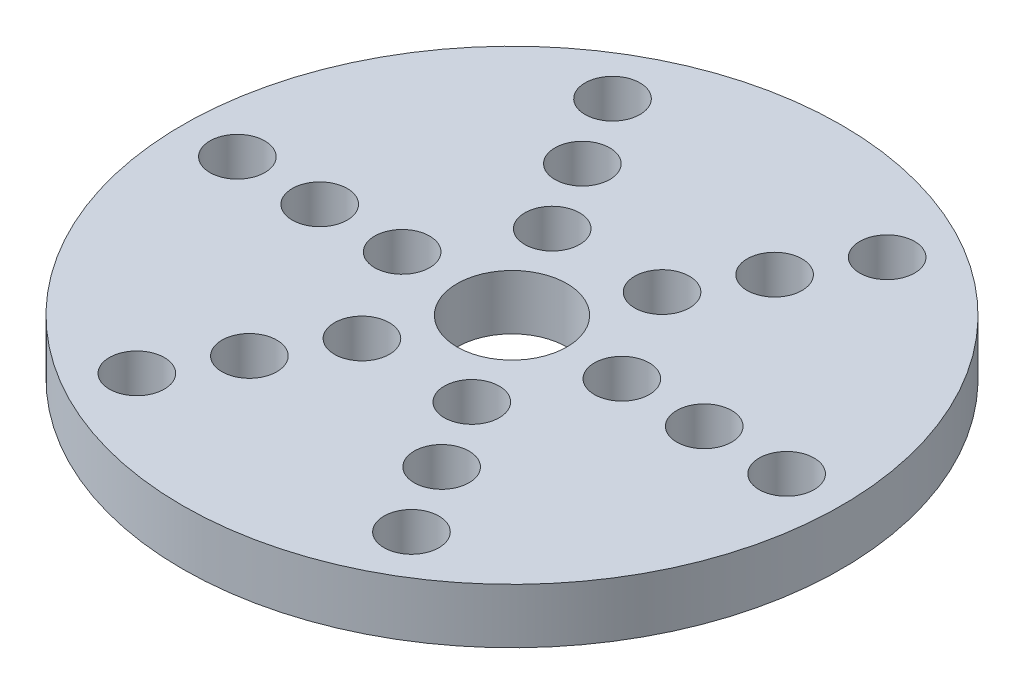
ISO-10303-21;
HEADER;
FILE_DESCRIPTION(('STEP AP214'),'2;1');
FILE_NAME('part.step','',(''),(''),'','','');
FILE_SCHEMA(('AUTOMOTIVE_DESIGN { 1 0 10303 214 1 1 1 1 }'));
ENDSEC;
DATA;
#1=APPLICATION_CONTEXT('core data for automotive mechanical design processes');
#2=APPLICATION_PROTOCOL_DEFINITION('international standard','automotive_design',2000,#1);
#3=PRODUCT_CONTEXT('',#1,'mechanical');
#4=PRODUCT('Part','Part','',(#3));
#5=PRODUCT_RELATED_PRODUCT_CATEGORY('part','',(#4));
#6=PRODUCT_DEFINITION_FORMATION('','',#4);
#7=PRODUCT_DEFINITION_CONTEXT('part definition',#1,'design');
#8=PRODUCT_DEFINITION('design','',#6,#7);
#9=PRODUCT_DEFINITION_SHAPE('','',#8);
#10=(LENGTH_UNIT() NAMED_UNIT(*) SI_UNIT(.MILLI.,.METRE.));
#11=(NAMED_UNIT(*) PLANE_ANGLE_UNIT() SI_UNIT($,.RADIAN.));
#12=(NAMED_UNIT(*) SI_UNIT($,.STERADIAN.) SOLID_ANGLE_UNIT());
#13=UNCERTAINTY_MEASURE_WITH_UNIT(LENGTH_MEASURE(1.E-05),#10,'distance_accuracy_value','');
#14=(GEOMETRIC_REPRESENTATION_CONTEXT(3) GLOBAL_UNCERTAINTY_ASSIGNED_CONTEXT((#13)) GLOBAL_UNIT_ASSIGNED_CONTEXT((#10,
#11,#12)) REPRESENTATION_CONTEXT('',''));
#15=CARTESIAN_POINT('',(0.,0.,0.));
#16=DIRECTION('',(0.,0.,1.));
#17=DIRECTION('',(1.,0.,0.));
#18=AXIS2_PLACEMENT_3D('',#15,#16,#17);
#19=CARTESIAN_POINT('',(0.,10.,0.));
#20=DIRECTION('',(0.,1.,0.));
#21=DIRECTION('',(0.,0.,1.));
#22=AXIS2_PLACEMENT_3D('',#19,#20,#21);
#23=PLANE('',#22);
#24=CARTESIAN_POINT('',(-35.,10.,-2.35922392732846E-13));
#25=DIRECTION('',(0.,1.,0.));
#26=DIRECTION('',(0.,0.,1.));
#27=AXIS2_PLACEMENT_3D('',#24,#25,#26);
#28=CIRCLE('',#27,5.);
#29=CARTESIAN_POINT('',(-35.,10.,4.99999999999976));
#30=VERTEX_POINT('',#29);
#31=EDGE_CURVE('E149',#30,#30,#28,.T.);
#32=ORIENTED_EDGE('',*,*,#31,.F.);
#33=EDGE_LOOP('',(#32));
#34=FACE_BOUND('',#33,.T.);
#35=CARTESIAN_POINT('',(-10.0000000000001,10.,17.3205080756887));
#36=DIRECTION('',(0.,1.,0.));
#37=DIRECTION('',(0.,0.,1.));
#38=AXIS2_PLACEMENT_3D('',#35,#36,#37);
#39=CIRCLE('',#38,5.00000000000001);
#40=CARTESIAN_POINT('',(-10.0000000000001,10.,22.3205080756887));
#41=VERTEX_POINT('',#40);
#42=EDGE_CURVE('E137',#41,#41,#39,.T.);
#43=ORIENTED_EDGE('',*,*,#42,.F.);
#44=EDGE_LOOP('',(#43));
#45=FACE_BOUND('',#44,.T.);
#46=CARTESIAN_POINT('',(-25.0000000000002,10.,43.3012701892218));
#47=DIRECTION('',(0.,1.,0.));
#48=DIRECTION('',(0.,0.,1.));
#49=AXIS2_PLACEMENT_3D('',#46,#47,#48);
#50=CIRCLE('',#49,5.);
#51=CARTESIAN_POINT('',(-25.0000000000002,10.,48.3012701892218));
#52=VERTEX_POINT('',#51);
#53=EDGE_CURVE('E125',#52,#52,#50,.T.);
#54=ORIENTED_EDGE('',*,*,#53,.F.);
#55=EDGE_LOOP('',(#54));
#56=FACE_BOUND('',#55,.T.);
#57=CARTESIAN_POINT('',(17.4999999999999,10.,30.3108891324554));
#58=DIRECTION('',(0.,1.,0.));
#59=DIRECTION('',(0.,0.,1.));
#60=AXIS2_PLACEMENT_3D('',#57,#58,#59);
#61=CIRCLE('',#60,5.);
#62=CARTESIAN_POINT('',(17.4999999999999,10.,35.3108891324554));
#63=VERTEX_POINT('',#62);
#64=EDGE_CURVE('E113',#63,#63,#61,.T.);
#65=ORIENTED_EDGE('',*,*,#64,.F.);
#66=EDGE_LOOP('',(#65));
#67=FACE_BOUND('',#66,.T.);
#68=CARTESIAN_POINT('',(20.,10.,0.));
#69=DIRECTION('',(0.,1.,0.));
#70=DIRECTION('',(0.,0.,1.));
#71=AXIS2_PLACEMENT_3D('',#68,#69,#70);
#72=CIRCLE('',#71,5.);
#73=CARTESIAN_POINT('',(20.,10.,5.));
#74=VERTEX_POINT('',#73);
#75=EDGE_CURVE('E101',#74,#74,#72,.T.);
#76=ORIENTED_EDGE('',*,*,#75,.F.);
#77=EDGE_LOOP('',(#76));
#78=FACE_BOUND('',#77,.T.);
#79=CARTESIAN_POINT('',(50.,10.,0.));
#80=DIRECTION('',(0.,1.,0.));
#81=DIRECTION('',(0.,0.,1.));
#82=AXIS2_PLACEMENT_3D('',#79,#80,#81);
#83=CIRCLE('',#82,5.);
#84=CARTESIAN_POINT('',(50.,10.,4.99999999999999));
#85=VERTEX_POINT('',#84);
#86=EDGE_CURVE('E89',#85,#85,#83,.T.);
#87=ORIENTED_EDGE('',*,*,#86,.F.);
#88=EDGE_LOOP('',(#87));
#89=FACE_BOUND('',#88,.T.);
#90=CARTESIAN_POINT('',(17.4999999999999,10.,-30.3108891324554));
#91=DIRECTION('',(0.,1.,0.));
#92=DIRECTION('',(0.,0.,1.));
#93=AXIS2_PLACEMENT_3D('',#90,#91,#92);
#94=CIRCLE('',#93,5.);
#95=CARTESIAN_POINT('',(17.4999999999999,10.,-25.3108891324554));
#96=VERTEX_POINT('',#95);
#97=EDGE_CURVE('E77',#96,#96,#94,.T.);
#98=ORIENTED_EDGE('',*,*,#97,.F.);
#99=EDGE_LOOP('',(#98));
#100=FACE_BOUND('',#99,.T.);
#101=CARTESIAN_POINT('',(0.,10.,0.));
#102=DIRECTION('',(0.,1.,0.));
#103=DIRECTION('',(0.,0.,1.));
#104=AXIS2_PLACEMENT_3D('',#101,#102,#103);
#105=CIRCLE('',#104,10.);
#106=CARTESIAN_POINT('',(0.,10.,10.));
#107=VERTEX_POINT('',#106);
#108=EDGE_CURVE('E65',#107,#107,#105,.T.);
#109=ORIENTED_EDGE('',*,*,#108,.F.);
#110=EDGE_LOOP('',(#109));
#111=FACE_BOUND('',#110,.T.);
#112=CARTESIAN_POINT('',(-17.5000000000001,10.,-30.3108891324553));
#113=DIRECTION('',(0.,1.,0.));
#114=DIRECTION('',(0.,0.,1.));
#115=AXIS2_PLACEMENT_3D('',#112,#113,#114);
#116=CIRCLE('',#115,5.);
#117=CARTESIAN_POINT('',(-17.5000000000001,10.,-25.3108891324553));
#118=VERTEX_POINT('',#117);
#119=EDGE_CURVE('E53',#118,#118,#116,.T.);
#120=ORIENTED_EDGE('',*,*,#119,.F.);
#121=EDGE_LOOP('',(#120));
#122=FACE_BOUND('',#121,.T.);
#123=CARTESIAN_POINT('',(0.,10.,0.));
#124=DIRECTION('',(0.,1.,0.));
#125=DIRECTION('',(0.,0.,1.));
#126=AXIS2_PLACEMENT_3D('',#123,#124,#125);
#127=CIRCLE('',#126,60.);
#128=CARTESIAN_POINT('',(0.,10.,60.));
#129=VERTEX_POINT('',#128);
#130=EDGE_CURVE('E10',#129,#129,#127,.T.);
#131=ORIENTED_EDGE('',*,*,#130,.T.);
#132=EDGE_LOOP('',(#131));
#133=FACE_BOUND('',#132,.T.);
#134=CARTESIAN_POINT('',(-25.0000000000002,10.,-43.3012701892218));
#135=DIRECTION('',(0.,1.,0.));
#136=DIRECTION('',(0.,0.,1.));
#137=AXIS2_PLACEMENT_3D('',#134,#135,#136);
#138=CIRCLE('',#137,5.);
#139=CARTESIAN_POINT('',(-25.0000000000002,10.,-38.3012701892218));
#140=VERTEX_POINT('',#139);
#141=EDGE_CURVE('E48',#140,#140,#138,.T.);
#142=ORIENTED_EDGE('',*,*,#141,.F.);
#143=EDGE_LOOP('',(#142));
#144=FACE_BOUND('',#143,.T.);
#145=CARTESIAN_POINT('',(-10.0000000000001,10.,-17.3205080756887));
#146=DIRECTION('',(0.,1.,0.));
#147=DIRECTION('',(0.,0.,1.));
#148=AXIS2_PLACEMENT_3D('',#145,#146,#147);
#149=CIRCLE('',#148,5.);
#150=CARTESIAN_POINT('',(-10.0000000000001,10.,-12.3205080756887));
#151=VERTEX_POINT('',#150);
#152=EDGE_CURVE('E59',#151,#151,#149,.T.);
#153=ORIENTED_EDGE('',*,*,#152,.F.);
#154=EDGE_LOOP('',(#153));
#155=FACE_BOUND('',#154,.T.);
#156=CARTESIAN_POINT('',(24.9999999999999,10.,-43.301270189222));
#157=DIRECTION('',(0.,1.,0.));
#158=DIRECTION('',(0.,0.,1.));
#159=AXIS2_PLACEMENT_3D('',#156,#157,#158);
#160=CIRCLE('',#159,5.);
#161=CARTESIAN_POINT('',(24.9999999999999,10.,-38.301270189222));
#162=VERTEX_POINT('',#161);
#163=EDGE_CURVE('E71',#162,#162,#160,.T.);
#164=ORIENTED_EDGE('',*,*,#163,.F.);
#165=EDGE_LOOP('',(#164));
#166=FACE_BOUND('',#165,.T.);
#167=CARTESIAN_POINT('',(9.99999999999996,10.,-17.3205080756888));
#168=DIRECTION('',(0.,1.,0.));
#169=DIRECTION('',(0.,0.,1.));
#170=AXIS2_PLACEMENT_3D('',#167,#168,#169);
#171=CIRCLE('',#170,5.);
#172=CARTESIAN_POINT('',(9.99999999999996,10.,-12.3205080756888));
#173=VERTEX_POINT('',#172);
#174=EDGE_CURVE('E83',#173,#173,#171,.T.);
#175=ORIENTED_EDGE('',*,*,#174,.F.);
#176=EDGE_LOOP('',(#175));
#177=FACE_BOUND('',#176,.T.);
#178=CARTESIAN_POINT('',(35.,10.,0.));
#179=DIRECTION('',(0.,1.,0.));
#180=DIRECTION('',(0.,0.,1.));
#181=AXIS2_PLACEMENT_3D('',#178,#179,#180);
#182=CIRCLE('',#181,5.);
#183=CARTESIAN_POINT('',(35.,10.,5.));
#184=VERTEX_POINT('',#183);
#185=EDGE_CURVE('E95',#184,#184,#182,.T.);
#186=ORIENTED_EDGE('',*,*,#185,.F.);
#187=EDGE_LOOP('',(#186));
#188=FACE_BOUND('',#187,.T.);
#189=CARTESIAN_POINT('',(24.9999999999999,10.,43.301270189222));
#190=DIRECTION('',(0.,1.,0.));
#191=DIRECTION('',(0.,0.,1.));
#192=AXIS2_PLACEMENT_3D('',#189,#190,#191);
#193=CIRCLE('',#192,5.);
#194=CARTESIAN_POINT('',(24.9999999999999,10.,48.301270189222));
#195=VERTEX_POINT('',#194);
#196=EDGE_CURVE('E107',#195,#195,#193,.T.);
#197=ORIENTED_EDGE('',*,*,#196,.F.);
#198=EDGE_LOOP('',(#197));
#199=FACE_BOUND('',#198,.T.);
#200=CARTESIAN_POINT('',(9.99999999999996,10.,17.3205080756888));
#201=DIRECTION('',(0.,1.,0.));
#202=DIRECTION('',(0.,0.,1.));
#203=AXIS2_PLACEMENT_3D('',#200,#201,#202);
#204=CIRCLE('',#203,5.);
#205=CARTESIAN_POINT('',(9.99999999999996,10.,22.3205080756888));
#206=VERTEX_POINT('',#205);
#207=EDGE_CURVE('E119',#206,#206,#204,.T.);
#208=ORIENTED_EDGE('',*,*,#207,.F.);
#209=EDGE_LOOP('',(#208));
#210=FACE_BOUND('',#209,.T.);
#211=CARTESIAN_POINT('',(-17.5000000000001,10.,30.3108891324553));
#212=DIRECTION('',(0.,1.,0.));
#213=DIRECTION('',(0.,0.,1.));
#214=AXIS2_PLACEMENT_3D('',#211,#212,#213);
#215=CIRCLE('',#214,5.);
#216=CARTESIAN_POINT('',(-17.5000000000001,10.,35.3108891324553));
#217=VERTEX_POINT('',#216);
#218=EDGE_CURVE('E131',#217,#217,#215,.T.);
#219=ORIENTED_EDGE('',*,*,#218,.F.);
#220=EDGE_LOOP('',(#219));
#221=FACE_BOUND('',#220,.T.);
#222=CARTESIAN_POINT('',(-50.,10.,-3.36536354339501E-13));
#223=DIRECTION('',(0.,1.,0.));
#224=DIRECTION('',(0.,0.,1.));
#225=AXIS2_PLACEMENT_3D('',#222,#223,#224);
#226=CIRCLE('',#225,5.);
#227=CARTESIAN_POINT('',(-50.,10.,4.99999999999966));
#228=VERTEX_POINT('',#227);
#229=EDGE_CURVE('E143',#228,#228,#226,.T.);
#230=ORIENTED_EDGE('',*,*,#229,.F.);
#231=EDGE_LOOP('',(#230));
#232=FACE_BOUND('',#231,.T.);
#233=CARTESIAN_POINT('',(-20.,10.,-1.35308431126191E-13));
#234=DIRECTION('',(0.,1.,0.));
#235=DIRECTION('',(0.,0.,1.));
#236=AXIS2_PLACEMENT_3D('',#233,#234,#235);
#237=CIRCLE('',#236,5.);
#238=CARTESIAN_POINT('',(-20.,10.,4.99999999999986));
#239=VERTEX_POINT('',#238);
#240=EDGE_CURVE('E155',#239,#239,#237,.T.);
#241=ORIENTED_EDGE('',*,*,#240,.F.);
#242=EDGE_LOOP('',(#241));
#243=FACE_BOUND('',#242,.T.);
#244=ADVANCED_FACE('F37',(#34,#45,#56,#67,#78,#89,#100,#111,#122,#133,#144,#155,#166,#177,#188,
#199,#210,#221,#232,#243),#23,.T.);
#245=CARTESIAN_POINT('',(0.,0.,0.));
#246=DIRECTION('',(0.,1.,0.));
#247=DIRECTION('',(0.,0.,1.));
#248=AXIS2_PLACEMENT_3D('',#245,#246,#247);
#249=PLANE('',#248);
#250=CARTESIAN_POINT('',(0.,0.,0.));
#251=DIRECTION('',(0.,1.,0.));
#252=DIRECTION('',(0.,0.,1.));
#253=AXIS2_PLACEMENT_3D('',#250,#251,#252);
#254=CIRCLE('',#253,60.);
#255=CARTESIAN_POINT('',(0.,0.,60.));
#256=VERTEX_POINT('',#255);
#257=EDGE_CURVE('E41',#256,#256,#254,.T.);
#258=ORIENTED_EDGE('',*,*,#257,.F.);
#259=EDGE_LOOP('',(#258));
#260=FACE_BOUND('',#259,.T.);
#261=CARTESIAN_POINT('',(-25.0000000000002,0.,-43.3012701892218));
#262=DIRECTION('',(0.,1.,0.));
#263=DIRECTION('',(0.,0.,1.));
#264=AXIS2_PLACEMENT_3D('',#261,#262,#263);
#265=CIRCLE('',#264,5.);
#266=CARTESIAN_POINT('',(-25.0000000000002,0.,-38.3012701892218));
#267=VERTEX_POINT('',#266);
#268=EDGE_CURVE('E50',#267,#267,#265,.T.);
#269=ORIENTED_EDGE('',*,*,#268,.T.);
#270=EDGE_LOOP('',(#269));
#271=FACE_BOUND('',#270,.T.);
#272=CARTESIAN_POINT('',(-17.5000000000001,0.,-30.3108891324553));
#273=DIRECTION('',(0.,1.,0.));
#274=DIRECTION('',(0.,0.,1.));
#275=AXIS2_PLACEMENT_3D('',#272,#273,#274);
#276=CIRCLE('',#275,5.);
#277=CARTESIAN_POINT('',(-17.5000000000001,0.,-25.3108891324553));
#278=VERTEX_POINT('',#277);
#279=EDGE_CURVE('E56',#278,#278,#276,.T.);
#280=ORIENTED_EDGE('',*,*,#279,.T.);
#281=EDGE_LOOP('',(#280));
#282=FACE_BOUND('',#281,.T.);
#283=CARTESIAN_POINT('',(-10.0000000000001,0.,-17.3205080756887));
#284=DIRECTION('',(0.,1.,0.));
#285=DIRECTION('',(0.,0.,1.));
#286=AXIS2_PLACEMENT_3D('',#283,#284,#285);
#287=CIRCLE('',#286,5.);
#288=CARTESIAN_POINT('',(-10.0000000000001,0.,-12.3205080756887));
#289=VERTEX_POINT('',#288);
#290=EDGE_CURVE('E62',#289,#289,#287,.T.);
#291=ORIENTED_EDGE('',*,*,#290,.T.);
#292=EDGE_LOOP('',(#291));
#293=FACE_BOUND('',#292,.T.);
#294=CARTESIAN_POINT('',(0.,0.,0.));
#295=DIRECTION('',(0.,1.,0.));
#296=DIRECTION('',(0.,0.,1.));
#297=AXIS2_PLACEMENT_3D('',#294,#295,#296);
#298=CIRCLE('',#297,10.);
#299=CARTESIAN_POINT('',(0.,0.,10.));
#300=VERTEX_POINT('',#299);
#301=EDGE_CURVE('E68',#300,#300,#298,.T.);
#302=ORIENTED_EDGE('',*,*,#301,.T.);
#303=EDGE_LOOP('',(#302));
#304=FACE_BOUND('',#303,.T.);
#305=CARTESIAN_POINT('',(24.9999999999999,0.,-43.301270189222));
#306=DIRECTION('',(0.,1.,0.));
#307=DIRECTION('',(0.,0.,1.));
#308=AXIS2_PLACEMENT_3D('',#305,#306,#307);
#309=CIRCLE('',#308,5.);
#310=CARTESIAN_POINT('',(24.9999999999999,0.,-38.301270189222));
#311=VERTEX_POINT('',#310);
#312=EDGE_CURVE('E74',#311,#311,#309,.T.);
#313=ORIENTED_EDGE('',*,*,#312,.T.);
#314=EDGE_LOOP('',(#313));
#315=FACE_BOUND('',#314,.T.);
#316=CARTESIAN_POINT('',(17.4999999999999,0.,-30.3108891324554));
#317=DIRECTION('',(0.,1.,0.));
#318=DIRECTION('',(0.,0.,1.));
#319=AXIS2_PLACEMENT_3D('',#316,#317,#318);
#320=CIRCLE('',#319,5.);
#321=CARTESIAN_POINT('',(17.4999999999999,0.,-25.3108891324554));
#322=VERTEX_POINT('',#321);
#323=EDGE_CURVE('E80',#322,#322,#320,.T.);
#324=ORIENTED_EDGE('',*,*,#323,.T.);
#325=EDGE_LOOP('',(#324));
#326=FACE_BOUND('',#325,.T.);
#327=CARTESIAN_POINT('',(9.99999999999996,0.,-17.3205080756888));
#328=DIRECTION('',(0.,1.,0.));
#329=DIRECTION('',(0.,0.,1.));
#330=AXIS2_PLACEMENT_3D('',#327,#328,#329);
#331=CIRCLE('',#330,5.);
#332=CARTESIAN_POINT('',(9.99999999999996,0.,-12.3205080756888));
#333=VERTEX_POINT('',#332);
#334=EDGE_CURVE('E86',#333,#333,#331,.T.);
#335=ORIENTED_EDGE('',*,*,#334,.T.);
#336=EDGE_LOOP('',(#335));
#337=FACE_BOUND('',#336,.T.);
#338=CARTESIAN_POINT('',(50.,0.,0.));
#339=DIRECTION('',(0.,1.,0.));
#340=DIRECTION('',(0.,0.,1.));
#341=AXIS2_PLACEMENT_3D('',#338,#339,#340);
#342=CIRCLE('',#341,5.);
#343=CARTESIAN_POINT('',(50.,0.,4.99999999999999));
#344=VERTEX_POINT('',#343);
#345=EDGE_CURVE('E92',#344,#344,#342,.T.);
#346=ORIENTED_EDGE('',*,*,#345,.T.);
#347=EDGE_LOOP('',(#346));
#348=FACE_BOUND('',#347,.T.);
#349=CARTESIAN_POINT('',(35.,0.,0.));
#350=DIRECTION('',(0.,1.,0.));
#351=DIRECTION('',(0.,0.,1.));
#352=AXIS2_PLACEMENT_3D('',#349,#350,#351);
#353=CIRCLE('',#352,5.);
#354=CARTESIAN_POINT('',(35.,0.,5.));
#355=VERTEX_POINT('',#354);
#356=EDGE_CURVE('E98',#355,#355,#353,.T.);
#357=ORIENTED_EDGE('',*,*,#356,.T.);
#358=EDGE_LOOP('',(#357));
#359=FACE_BOUND('',#358,.T.);
#360=CARTESIAN_POINT('',(20.,0.,0.));
#361=DIRECTION('',(0.,1.,0.));
#362=DIRECTION('',(0.,0.,1.));
#363=AXIS2_PLACEMENT_3D('',#360,#361,#362);
#364=CIRCLE('',#363,5.);
#365=CARTESIAN_POINT('',(20.,0.,5.));
#366=VERTEX_POINT('',#365);
#367=EDGE_CURVE('E104',#366,#366,#364,.T.);
#368=ORIENTED_EDGE('',*,*,#367,.T.);
#369=EDGE_LOOP('',(#368));
#370=FACE_BOUND('',#369,.T.);
#371=CARTESIAN_POINT('',(24.9999999999999,0.,43.301270189222));
#372=DIRECTION('',(0.,1.,0.));
#373=DIRECTION('',(0.,0.,1.));
#374=AXIS2_PLACEMENT_3D('',#371,#372,#373);
#375=CIRCLE('',#374,5.);
#376=CARTESIAN_POINT('',(24.9999999999999,0.,48.301270189222));
#377=VERTEX_POINT('',#376);
#378=EDGE_CURVE('E110',#377,#377,#375,.T.);
#379=ORIENTED_EDGE('',*,*,#378,.T.);
#380=EDGE_LOOP('',(#379));
#381=FACE_BOUND('',#380,.T.);
#382=CARTESIAN_POINT('',(17.4999999999999,0.,30.3108891324554));
#383=DIRECTION('',(0.,1.,0.));
#384=DIRECTION('',(0.,0.,1.));
#385=AXIS2_PLACEMENT_3D('',#382,#383,#384);
#386=CIRCLE('',#385,5.);
#387=CARTESIAN_POINT('',(17.4999999999999,0.,35.3108891324554));
#388=VERTEX_POINT('',#387);
#389=EDGE_CURVE('E116',#388,#388,#386,.T.);
#390=ORIENTED_EDGE('',*,*,#389,.T.);
#391=EDGE_LOOP('',(#390));
#392=FACE_BOUND('',#391,.T.);
#393=CARTESIAN_POINT('',(9.99999999999996,0.,17.3205080756888));
#394=DIRECTION('',(0.,1.,0.));
#395=DIRECTION('',(0.,0.,1.));
#396=AXIS2_PLACEMENT_3D('',#393,#394,#395);
#397=CIRCLE('',#396,5.);
#398=CARTESIAN_POINT('',(9.99999999999996,0.,22.3205080756888));
#399=VERTEX_POINT('',#398);
#400=EDGE_CURVE('E122',#399,#399,#397,.T.);
#401=ORIENTED_EDGE('',*,*,#400,.T.);
#402=EDGE_LOOP('',(#401));
#403=FACE_BOUND('',#402,.T.);
#404=CARTESIAN_POINT('',(-25.0000000000002,0.,43.3012701892218));
#405=DIRECTION('',(0.,1.,0.));
#406=DIRECTION('',(0.,0.,1.));
#407=AXIS2_PLACEMENT_3D('',#404,#405,#406);
#408=CIRCLE('',#407,5.);
#409=CARTESIAN_POINT('',(-25.0000000000002,0.,48.3012701892218));
#410=VERTEX_POINT('',#409);
#411=EDGE_CURVE('E128',#410,#410,#408,.T.);
#412=ORIENTED_EDGE('',*,*,#411,.T.);
#413=EDGE_LOOP('',(#412));
#414=FACE_BOUND('',#413,.T.);
#415=CARTESIAN_POINT('',(-17.5000000000001,0.,30.3108891324553));
#416=DIRECTION('',(0.,1.,0.));
#417=DIRECTION('',(0.,0.,1.));
#418=AXIS2_PLACEMENT_3D('',#415,#416,#417);
#419=CIRCLE('',#418,5.);
#420=CARTESIAN_POINT('',(-17.5000000000001,0.,35.3108891324553));
#421=VERTEX_POINT('',#420);
#422=EDGE_CURVE('E134',#421,#421,#419,.T.);
#423=ORIENTED_EDGE('',*,*,#422,.T.);
#424=EDGE_LOOP('',(#423));
#425=FACE_BOUND('',#424,.T.);
#426=CARTESIAN_POINT('',(-10.0000000000001,0.,17.3205080756887));
#427=DIRECTION('',(0.,1.,0.));
#428=DIRECTION('',(0.,0.,1.));
#429=AXIS2_PLACEMENT_3D('',#426,#427,#428);
#430=CIRCLE('',#429,5.00000000000001);
#431=CARTESIAN_POINT('',(-10.0000000000001,0.,22.3205080756887));
#432=VERTEX_POINT('',#431);
#433=EDGE_CURVE('E140',#432,#432,#430,.T.);
#434=ORIENTED_EDGE('',*,*,#433,.T.);
#435=EDGE_LOOP('',(#434));
#436=FACE_BOUND('',#435,.T.);
#437=CARTESIAN_POINT('',(-50.,0.,-3.36536354339501E-13));
#438=DIRECTION('',(0.,1.,0.));
#439=DIRECTION('',(0.,0.,1.));
#440=AXIS2_PLACEMENT_3D('',#437,#438,#439);
#441=CIRCLE('',#440,5.);
#442=CARTESIAN_POINT('',(-50.,0.,4.99999999999966));
#443=VERTEX_POINT('',#442);
#444=EDGE_CURVE('E146',#443,#443,#441,.T.);
#445=ORIENTED_EDGE('',*,*,#444,.T.);
#446=EDGE_LOOP('',(#445));
#447=FACE_BOUND('',#446,.T.);
#448=CARTESIAN_POINT('',(-35.,0.,-2.35922392732846E-13));
#449=DIRECTION('',(0.,1.,0.));
#450=DIRECTION('',(0.,0.,1.));
#451=AXIS2_PLACEMENT_3D('',#448,#449,#450);
#452=CIRCLE('',#451,5.);
#453=CARTESIAN_POINT('',(-35.,0.,4.99999999999976));
#454=VERTEX_POINT('',#453);
#455=EDGE_CURVE('E152',#454,#454,#452,.T.);
#456=ORIENTED_EDGE('',*,*,#455,.T.);
#457=EDGE_LOOP('',(#456));
#458=FACE_BOUND('',#457,.T.);
#459=CARTESIAN_POINT('',(-20.,0.,-1.35308431126191E-13));
#460=DIRECTION('',(0.,1.,0.));
#461=DIRECTION('',(0.,0.,1.));
#462=AXIS2_PLACEMENT_3D('',#459,#460,#461);
#463=CIRCLE('',#462,5.);
#464=CARTESIAN_POINT('',(-20.,0.,4.99999999999986));
#465=VERTEX_POINT('',#464);
#466=EDGE_CURVE('E158',#465,#465,#463,.T.);
#467=ORIENTED_EDGE('',*,*,#466,.T.);
#468=EDGE_LOOP('',(#467));
#469=FACE_BOUND('',#468,.T.);
#470=ADVANCED_FACE('F168',(#260,#271,#282,#293,#304,#315,#326,#337,#348,#359,#370,#381,#392,
#403,#414,#425,#436,#447,#458,#469),#249,.F.);
#471=CARTESIAN_POINT('',(0.,10.,0.));
#472=DIRECTION('',(0.,-1.,0.));
#473=DIRECTION('',(0.,0.,-1.));
#474=AXIS2_PLACEMENT_3D('',#471,#472,#473);
#475=CYLINDRICAL_SURFACE('',#474,60.);
#476=ORIENTED_EDGE('',*,*,#257,.T.);
#477=EDGE_LOOP('',(#476));
#478=FACE_BOUND('',#477,.T.);
#479=ORIENTED_EDGE('',*,*,#130,.F.);
#480=EDGE_LOOP('',(#479));
#481=FACE_BOUND('',#480,.T.);
#482=ADVANCED_FACE('F39',(#478,#481),#475,.T.);
#483=CARTESIAN_POINT('',(-25.0000000000002,10.,-43.3012701892218));
#484=DIRECTION('',(0.,-1.,0.));
#485=DIRECTION('',(0.,0.,-1.));
#486=AXIS2_PLACEMENT_3D('',#483,#484,#485);
#487=CYLINDRICAL_SURFACE('',#486,5.);
#488=ORIENTED_EDGE('',*,*,#141,.T.);
#489=EDGE_LOOP('',(#488));
#490=FACE_BOUND('',#489,.T.);
#491=ORIENTED_EDGE('',*,*,#268,.F.);
#492=EDGE_LOOP('',(#491));
#493=FACE_BOUND('',#492,.T.);
#494=ADVANCED_FACE('F178',(#490,#493),#487,.F.);
#495=CARTESIAN_POINT('',(-17.5000000000001,10.,-30.3108891324553));
#496=DIRECTION('',(0.,-1.,0.));
#497=DIRECTION('',(0.,0.,-1.));
#498=AXIS2_PLACEMENT_3D('',#495,#496,#497);
#499=CYLINDRICAL_SURFACE('',#498,5.);
#500=ORIENTED_EDGE('',*,*,#119,.T.);
#501=EDGE_LOOP('',(#500));
#502=FACE_BOUND('',#501,.T.);
#503=ORIENTED_EDGE('',*,*,#279,.F.);
#504=EDGE_LOOP('',(#503));
#505=FACE_BOUND('',#504,.T.);
#506=ADVANCED_FACE('F181',(#502,#505),#499,.F.);
#507=CARTESIAN_POINT('',(-10.0000000000001,10.,-17.3205080756887));
#508=DIRECTION('',(0.,-1.,0.));
#509=DIRECTION('',(0.,0.,-1.));
#510=AXIS2_PLACEMENT_3D('',#507,#508,#509);
#511=CYLINDRICAL_SURFACE('',#510,5.);
#512=ORIENTED_EDGE('',*,*,#152,.T.);
#513=EDGE_LOOP('',(#512));
#514=FACE_BOUND('',#513,.T.);
#515=ORIENTED_EDGE('',*,*,#290,.F.);
#516=EDGE_LOOP('',(#515));
#517=FACE_BOUND('',#516,.T.);
#518=ADVANCED_FACE('F185',(#514,#517),#511,.F.);
#519=CARTESIAN_POINT('',(0.,10.,0.));
#520=DIRECTION('',(0.,-1.,0.));
#521=DIRECTION('',(0.,0.,-1.));
#522=AXIS2_PLACEMENT_3D('',#519,#520,#521);
#523=CYLINDRICAL_SURFACE('',#522,10.);
#524=ORIENTED_EDGE('',*,*,#301,.F.);
#525=EDGE_LOOP('',(#524));
#526=FACE_BOUND('',#525,.T.);
#527=ORIENTED_EDGE('',*,*,#108,.T.);
#528=EDGE_LOOP('',(#527));
#529=FACE_BOUND('',#528,.T.);
#530=ADVANCED_FACE('F189',(#526,#529),#523,.F.);
#531=CARTESIAN_POINT('',(24.9999999999999,10.,-43.301270189222));
#532=DIRECTION('',(0.,-1.,0.));
#533=DIRECTION('',(0.,0.,-1.));
#534=AXIS2_PLACEMENT_3D('',#531,#532,#533);
#535=CYLINDRICAL_SURFACE('',#534,5.);
#536=ORIENTED_EDGE('',*,*,#163,.T.);
#537=EDGE_LOOP('',(#536));
#538=FACE_BOUND('',#537,.T.);
#539=ORIENTED_EDGE('',*,*,#312,.F.);
#540=EDGE_LOOP('',(#539));
#541=FACE_BOUND('',#540,.T.);
#542=ADVANCED_FACE('F193',(#538,#541),#535,.F.);
#543=CARTESIAN_POINT('',(17.4999999999999,10.,-30.3108891324554));
#544=DIRECTION('',(0.,-1.,0.));
#545=DIRECTION('',(0.,0.,-1.));
#546=AXIS2_PLACEMENT_3D('',#543,#544,#545);
#547=CYLINDRICAL_SURFACE('',#546,5.);
#548=ORIENTED_EDGE('',*,*,#97,.T.);
#549=EDGE_LOOP('',(#548));
#550=FACE_BOUND('',#549,.T.);
#551=ORIENTED_EDGE('',*,*,#323,.F.);
#552=EDGE_LOOP('',(#551));
#553=FACE_BOUND('',#552,.T.);
#554=ADVANCED_FACE('F197',(#550,#553),#547,.F.);
#555=CARTESIAN_POINT('',(9.99999999999996,10.,-17.3205080756888));
#556=DIRECTION('',(0.,-1.,0.));
#557=DIRECTION('',(0.,0.,-1.));
#558=AXIS2_PLACEMENT_3D('',#555,#556,#557);
#559=CYLINDRICAL_SURFACE('',#558,5.);
#560=ORIENTED_EDGE('',*,*,#174,.T.);
#561=EDGE_LOOP('',(#560));
#562=FACE_BOUND('',#561,.T.);
#563=ORIENTED_EDGE('',*,*,#334,.F.);
#564=EDGE_LOOP('',(#563));
#565=FACE_BOUND('',#564,.T.);
#566=ADVANCED_FACE('F201',(#562,#565),#559,.F.);
#567=CARTESIAN_POINT('',(50.,10.,0.));
#568=DIRECTION('',(0.,-1.,0.));
#569=DIRECTION('',(0.,0.,-1.));
#570=AXIS2_PLACEMENT_3D('',#567,#568,#569);
#571=CYLINDRICAL_SURFACE('',#570,5.);
#572=ORIENTED_EDGE('',*,*,#86,.T.);
#573=EDGE_LOOP('',(#572));
#574=FACE_BOUND('',#573,.T.);
#575=ORIENTED_EDGE('',*,*,#345,.F.);
#576=EDGE_LOOP('',(#575));
#577=FACE_BOUND('',#576,.T.);
#578=ADVANCED_FACE('F205',(#574,#577),#571,.F.);
#579=CARTESIAN_POINT('',(35.,10.,0.));
#580=DIRECTION('',(0.,-1.,0.));
#581=DIRECTION('',(0.,0.,-1.));
#582=AXIS2_PLACEMENT_3D('',#579,#580,#581);
#583=CYLINDRICAL_SURFACE('',#582,5.);
#584=ORIENTED_EDGE('',*,*,#185,.T.);
#585=EDGE_LOOP('',(#584));
#586=FACE_BOUND('',#585,.T.);
#587=ORIENTED_EDGE('',*,*,#356,.F.);
#588=EDGE_LOOP('',(#587));
#589=FACE_BOUND('',#588,.T.);
#590=ADVANCED_FACE('F209',(#586,#589),#583,.F.);
#591=CARTESIAN_POINT('',(20.,10.,0.));
#592=DIRECTION('',(0.,-1.,0.));
#593=DIRECTION('',(0.,0.,-1.));
#594=AXIS2_PLACEMENT_3D('',#591,#592,#593);
#595=CYLINDRICAL_SURFACE('',#594,5.);
#596=ORIENTED_EDGE('',*,*,#75,.T.);
#597=EDGE_LOOP('',(#596));
#598=FACE_BOUND('',#597,.T.);
#599=ORIENTED_EDGE('',*,*,#367,.F.);
#600=EDGE_LOOP('',(#599));
#601=FACE_BOUND('',#600,.T.);
#602=ADVANCED_FACE('F213',(#598,#601),#595,.F.);
#603=CARTESIAN_POINT('',(24.9999999999999,10.,43.301270189222));
#604=DIRECTION('',(0.,-1.,0.));
#605=DIRECTION('',(0.,0.,-1.));
#606=AXIS2_PLACEMENT_3D('',#603,#604,#605);
#607=CYLINDRICAL_SURFACE('',#606,5.);
#608=ORIENTED_EDGE('',*,*,#196,.T.);
#609=EDGE_LOOP('',(#608));
#610=FACE_BOUND('',#609,.T.);
#611=ORIENTED_EDGE('',*,*,#378,.F.);
#612=EDGE_LOOP('',(#611));
#613=FACE_BOUND('',#612,.T.);
#614=ADVANCED_FACE('F217',(#610,#613),#607,.F.);
#615=CARTESIAN_POINT('',(17.4999999999999,10.,30.3108891324554));
#616=DIRECTION('',(0.,-1.,0.));
#617=DIRECTION('',(0.,0.,-1.));
#618=AXIS2_PLACEMENT_3D('',#615,#616,#617);
#619=CYLINDRICAL_SURFACE('',#618,5.);
#620=ORIENTED_EDGE('',*,*,#64,.T.);
#621=EDGE_LOOP('',(#620));
#622=FACE_BOUND('',#621,.T.);
#623=ORIENTED_EDGE('',*,*,#389,.F.);
#624=EDGE_LOOP('',(#623));
#625=FACE_BOUND('',#624,.T.);
#626=ADVANCED_FACE('F221',(#622,#625),#619,.F.);
#627=CARTESIAN_POINT('',(9.99999999999996,10.,17.3205080756888));
#628=DIRECTION('',(0.,-1.,0.));
#629=DIRECTION('',(0.,0.,-1.));
#630=AXIS2_PLACEMENT_3D('',#627,#628,#629);
#631=CYLINDRICAL_SURFACE('',#630,5.);
#632=ORIENTED_EDGE('',*,*,#207,.T.);
#633=EDGE_LOOP('',(#632));
#634=FACE_BOUND('',#633,.T.);
#635=ORIENTED_EDGE('',*,*,#400,.F.);
#636=EDGE_LOOP('',(#635));
#637=FACE_BOUND('',#636,.T.);
#638=ADVANCED_FACE('F225',(#634,#637),#631,.F.);
#639=CARTESIAN_POINT('',(-25.0000000000002,10.,43.3012701892218));
#640=DIRECTION('',(0.,-1.,0.));
#641=DIRECTION('',(0.,0.,-1.));
#642=AXIS2_PLACEMENT_3D('',#639,#640,#641);
#643=CYLINDRICAL_SURFACE('',#642,5.);
#644=ORIENTED_EDGE('',*,*,#53,.T.);
#645=EDGE_LOOP('',(#644));
#646=FACE_BOUND('',#645,.T.);
#647=ORIENTED_EDGE('',*,*,#411,.F.);
#648=EDGE_LOOP('',(#647));
#649=FACE_BOUND('',#648,.T.);
#650=ADVANCED_FACE('F229',(#646,#649),#643,.F.);
#651=CARTESIAN_POINT('',(-17.5000000000001,10.,30.3108891324553));
#652=DIRECTION('',(0.,-1.,0.));
#653=DIRECTION('',(0.,0.,-1.));
#654=AXIS2_PLACEMENT_3D('',#651,#652,#653);
#655=CYLINDRICAL_SURFACE('',#654,5.);
#656=ORIENTED_EDGE('',*,*,#218,.T.);
#657=EDGE_LOOP('',(#656));
#658=FACE_BOUND('',#657,.T.);
#659=ORIENTED_EDGE('',*,*,#422,.F.);
#660=EDGE_LOOP('',(#659));
#661=FACE_BOUND('',#660,.T.);
#662=ADVANCED_FACE('F233',(#658,#661),#655,.F.);
#663=CARTESIAN_POINT('',(-10.0000000000001,10.,17.3205080756887));
#664=DIRECTION('',(0.,-1.,0.));
#665=DIRECTION('',(0.,0.,-1.));
#666=AXIS2_PLACEMENT_3D('',#663,#664,#665);
#667=CYLINDRICAL_SURFACE('',#666,5.00000000000001);
#668=ORIENTED_EDGE('',*,*,#42,.T.);
#669=EDGE_LOOP('',(#668));
#670=FACE_BOUND('',#669,.T.);
#671=ORIENTED_EDGE('',*,*,#433,.F.);
#672=EDGE_LOOP('',(#671));
#673=FACE_BOUND('',#672,.T.);
#674=ADVANCED_FACE('F237',(#670,#673),#667,.F.);
#675=CARTESIAN_POINT('',(-50.,10.,-3.36536354339501E-13));
#676=DIRECTION('',(0.,-1.,0.));
#677=DIRECTION('',(0.,0.,-1.));
#678=AXIS2_PLACEMENT_3D('',#675,#676,#677);
#679=CYLINDRICAL_SURFACE('',#678,5.);
#680=ORIENTED_EDGE('',*,*,#229,.T.);
#681=EDGE_LOOP('',(#680));
#682=FACE_BOUND('',#681,.T.);
#683=ORIENTED_EDGE('',*,*,#444,.F.);
#684=EDGE_LOOP('',(#683));
#685=FACE_BOUND('',#684,.T.);
#686=ADVANCED_FACE('F241',(#682,#685),#679,.F.);
#687=CARTESIAN_POINT('',(-35.,10.,-2.35922392732846E-13));
#688=DIRECTION('',(0.,-1.,0.));
#689=DIRECTION('',(0.,0.,-1.));
#690=AXIS2_PLACEMENT_3D('',#687,#688,#689);
#691=CYLINDRICAL_SURFACE('',#690,5.);
#692=ORIENTED_EDGE('',*,*,#31,.T.);
#693=EDGE_LOOP('',(#692));
#694=FACE_BOUND('',#693,.T.);
#695=ORIENTED_EDGE('',*,*,#455,.F.);
#696=EDGE_LOOP('',(#695));
#697=FACE_BOUND('',#696,.T.);
#698=ADVANCED_FACE('F245',(#694,#697),#691,.F.);
#699=CARTESIAN_POINT('',(-20.,10.,-1.35308431126191E-13));
#700=DIRECTION('',(0.,-1.,0.));
#701=DIRECTION('',(0.,0.,-1.));
#702=AXIS2_PLACEMENT_3D('',#699,#700,#701);
#703=CYLINDRICAL_SURFACE('',#702,5.);
#704=ORIENTED_EDGE('',*,*,#240,.T.);
#705=EDGE_LOOP('',(#704));
#706=FACE_BOUND('',#705,.T.);
#707=ORIENTED_EDGE('',*,*,#466,.F.);
#708=EDGE_LOOP('',(#707));
#709=FACE_BOUND('',#708,.T.);
#710=ADVANCED_FACE('F164',(#706,#709),#703,.F.);
#711=CLOSED_SHELL('',(#244,#470,#482,#494,#506,#518,#530,#542,#554,#566,#578,#590,#602,#614,
#626,#638,#650,#662,#674,#686,#698,#710));
#712=MANIFOLD_SOLID_BREP('B2',#711);
#713=ADVANCED_BREP_SHAPE_REPRESENTATION('',(#18,#712),#14);
#714=SHAPE_DEFINITION_REPRESENTATION(#9,#713);
ENDSEC;
END-ISO-10303-21;
